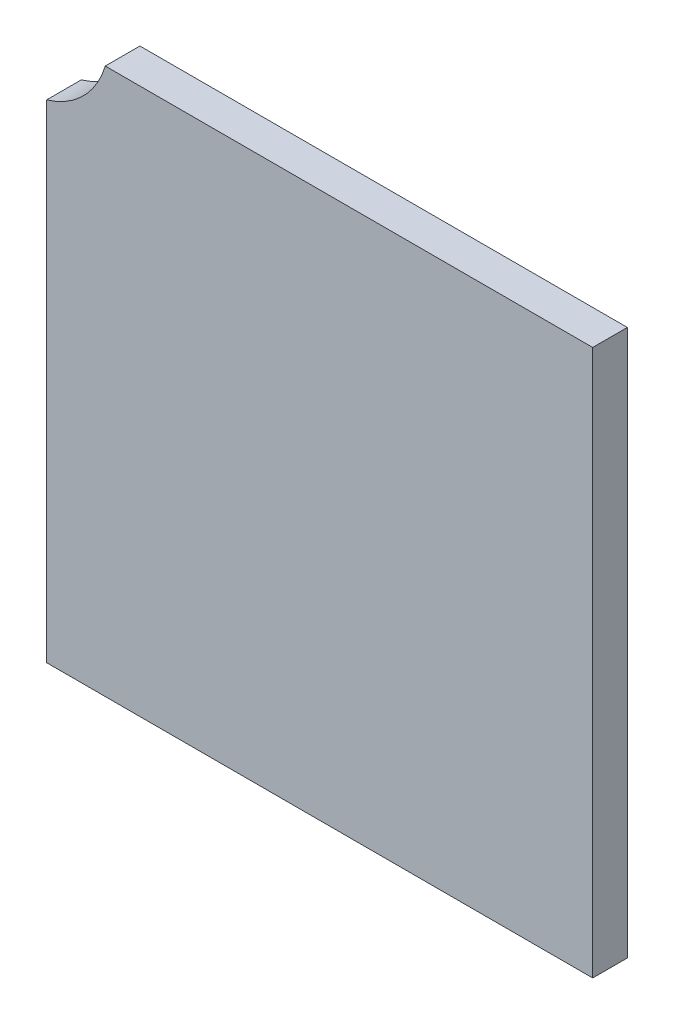
ISO-10303-21;
HEADER;
FILE_DESCRIPTION(('STEP AP214'),'2;1');
FILE_NAME('part.step','',(''),(''),'','','');
FILE_SCHEMA(('AUTOMOTIVE_DESIGN { 1 0 10303 214 1 1 1 1 }'));
ENDSEC;
DATA;
#1=APPLICATION_CONTEXT('core data for automotive mechanical design processes');
#2=APPLICATION_PROTOCOL_DEFINITION('international standard','automotive_design',2000,#1);
#3=PRODUCT_CONTEXT('',#1,'mechanical');
#4=PRODUCT('Part','Part','',(#3));
#5=PRODUCT_RELATED_PRODUCT_CATEGORY('part','',(#4));
#6=PRODUCT_DEFINITION_FORMATION('','',#4);
#7=PRODUCT_DEFINITION_CONTEXT('part definition',#1,'design');
#8=PRODUCT_DEFINITION('design','',#6,#7);
#9=PRODUCT_DEFINITION_SHAPE('','',#8);
#10=(LENGTH_UNIT() NAMED_UNIT(*) SI_UNIT(.MILLI.,.METRE.));
#11=(NAMED_UNIT(*) PLANE_ANGLE_UNIT() SI_UNIT($,.RADIAN.));
#12=(NAMED_UNIT(*) SI_UNIT($,.STERADIAN.) SOLID_ANGLE_UNIT());
#13=UNCERTAINTY_MEASURE_WITH_UNIT(LENGTH_MEASURE(1.E-05),#10,'distance_accuracy_value','');
#14=(GEOMETRIC_REPRESENTATION_CONTEXT(3) GLOBAL_UNCERTAINTY_ASSIGNED_CONTEXT((#13)) GLOBAL_UNIT_ASSIGNED_CONTEXT((#10,
#11,#12)) REPRESENTATION_CONTEXT('',''));
#15=CARTESIAN_POINT('',(0.,0.,0.));
#16=DIRECTION('',(0.,0.,1.));
#17=DIRECTION('',(1.,0.,0.));
#18=AXIS2_PLACEMENT_3D('',#15,#16,#17);
#19=CARTESIAN_POINT('',(-1.575,1.575,0.2));
#20=DIRECTION('',(-1.,0.,0.));
#21=DIRECTION('',(0.,-1.,0.));
#22=AXIS2_PLACEMENT_3D('',#19,#20,#21);
#23=PLANE('',#22);
#24=DIRECTION('',(0.,0.,1.));
#25=VECTOR('',#24,1.);
#26=CARTESIAN_POINT('',(-1.575,1.23683820390604,0.9));
#27=LINE('',#26,#25);
#28=CARTESIAN_POINT('',(-1.575,1.23683820390604,0.));
#29=VERTEX_POINT('',#28);
#30=CARTESIAN_POINT('',(-1.575,1.23683820390604,0.2));
#31=VERTEX_POINT('',#30);
#32=EDGE_CURVE('E11',#29,#31,#27,.T.);
#33=ORIENTED_EDGE('',*,*,#32,.F.);
#34=DIRECTION('',(0.,1.,0.));
#35=VECTOR('',#34,1.);
#36=CARTESIAN_POINT('',(-1.575,1.575,0.));
#37=LINE('',#36,#35);
#38=CARTESIAN_POINT('',(-1.575,-1.575,0.));
#39=VERTEX_POINT('',#38);
#40=EDGE_CURVE('E23',#39,#29,#37,.T.);
#41=ORIENTED_EDGE('',*,*,#40,.F.);
#42=DIRECTION('',(0.,0.,-1.));
#43=VECTOR('',#42,1.);
#44=CARTESIAN_POINT('',(-1.575,-1.575,0.2));
#45=LINE('',#44,#43);
#46=CARTESIAN_POINT('',(-1.575,-1.575,0.2));
#47=VERTEX_POINT('',#46);
#48=EDGE_CURVE('E98',#47,#39,#45,.T.);
#49=ORIENTED_EDGE('',*,*,#48,.F.);
#50=DIRECTION('',(0.,1.,0.));
#51=VECTOR('',#50,1.);
#52=CARTESIAN_POINT('',(-1.575,1.575,0.2));
#53=LINE('',#52,#51);
#54=EDGE_CURVE('E96',#47,#31,#53,.T.);
#55=ORIENTED_EDGE('',*,*,#54,.T.);
#56=EDGE_LOOP('',(#33,#41,#49,#55));
#57=FACE_BOUND('',#56,.T.);
#58=ADVANCED_FACE('F16',(#57),#23,.T.);
#59=CARTESIAN_POINT('',(1.575,-1.575,0.2));
#60=DIRECTION('',(0.,-1.,0.));
#61=DIRECTION('',(0.,0.,-1.));
#62=AXIS2_PLACEMENT_3D('',#59,#60,#61);
#63=PLANE('',#62);
#64=DIRECTION('',(-1.,0.,0.));
#65=VECTOR('',#64,1.);
#66=CARTESIAN_POINT('',(1.575,-1.575,0.));
#67=LINE('',#66,#65);
#68=CARTESIAN_POINT('',(1.575,-1.575,0.));
#69=VERTEX_POINT('',#68);
#70=EDGE_CURVE('E94',#69,#39,#67,.T.);
#71=ORIENTED_EDGE('',*,*,#70,.F.);
#72=DIRECTION('',(0.,0.,-1.));
#73=VECTOR('',#72,1.);
#74=CARTESIAN_POINT('',(1.575,-1.575,0.2));
#75=LINE('',#74,#73);
#76=CARTESIAN_POINT('',(1.575,-1.575,0.2));
#77=VERTEX_POINT('',#76);
#78=EDGE_CURVE('E91',#77,#69,#75,.T.);
#79=ORIENTED_EDGE('',*,*,#78,.F.);
#80=DIRECTION('',(-1.,0.,0.));
#81=VECTOR('',#80,1.);
#82=CARTESIAN_POINT('',(1.575,-1.575,0.2));
#83=LINE('',#82,#81);
#84=EDGE_CURVE('E88',#77,#47,#83,.T.);
#85=ORIENTED_EDGE('',*,*,#84,.T.);
#86=ORIENTED_EDGE('',*,*,#48,.T.);
#87=EDGE_LOOP('',(#71,#79,#85,#86));
#88=FACE_BOUND('',#87,.T.);
#89=ADVANCED_FACE('F101',(#88),#63,.T.);
#90=CARTESIAN_POINT('',(1.575,1.575,0.2));
#91=DIRECTION('',(1.,0.,0.));
#92=DIRECTION('',(0.,1.,0.));
#93=AXIS2_PLACEMENT_3D('',#90,#91,#92);
#94=PLANE('',#93);
#95=DIRECTION('',(0.,-1.,0.));
#96=VECTOR('',#95,1.);
#97=CARTESIAN_POINT('',(1.575,1.575,0.));
#98=LINE('',#97,#96);
#99=CARTESIAN_POINT('',(1.575,1.575,0.));
#100=VERTEX_POINT('',#99);
#101=EDGE_CURVE('E86',#100,#69,#98,.T.);
#102=ORIENTED_EDGE('',*,*,#101,.F.);
#103=DIRECTION('',(0.,0.,-1.));
#104=VECTOR('',#103,1.);
#105=CARTESIAN_POINT('',(1.575,1.575,0.2));
#106=LINE('',#105,#104);
#107=CARTESIAN_POINT('',(1.575,1.575,0.2));
#108=VERTEX_POINT('',#107);
#109=EDGE_CURVE('E73',#108,#100,#106,.T.);
#110=ORIENTED_EDGE('',*,*,#109,.F.);
#111=DIRECTION('',(0.,-1.,0.));
#112=VECTOR('',#111,1.);
#113=CARTESIAN_POINT('',(1.575,1.575,0.2));
#114=LINE('',#113,#112);
#115=EDGE_CURVE('E66',#108,#77,#114,.T.);
#116=ORIENTED_EDGE('',*,*,#115,.T.);
#117=ORIENTED_EDGE('',*,*,#78,.T.);
#118=EDGE_LOOP('',(#102,#110,#116,#117));
#119=FACE_BOUND('',#118,.T.);
#120=ADVANCED_FACE('F105',(#119),#94,.T.);
#121=CARTESIAN_POINT('',(1.575,1.575,0.2));
#122=DIRECTION('',(0.,1.,0.));
#123=DIRECTION('',(0.,0.,1.));
#124=AXIS2_PLACEMENT_3D('',#121,#122,#123);
#125=PLANE('',#124);
#126=DIRECTION('',(0.,0.,-1.));
#127=VECTOR('',#126,1.);
#128=CARTESIAN_POINT('',(-1.23683820390604,1.575,0.9));
#129=LINE('',#128,#127);
#130=CARTESIAN_POINT('',(-1.23683820390604,1.575,0.2));
#131=VERTEX_POINT('',#130);
#132=CARTESIAN_POINT('',(-1.23683820390604,1.575,0.));
#133=VERTEX_POINT('',#132);
#134=EDGE_CURVE('E56',#131,#133,#129,.T.);
#135=ORIENTED_EDGE('',*,*,#134,.F.);
#136=DIRECTION('',(1.,0.,0.));
#137=VECTOR('',#136,1.);
#138=CARTESIAN_POINT('',(1.575,1.575,0.2));
#139=LINE('',#138,#137);
#140=EDGE_CURVE('E67',#131,#108,#139,.T.);
#141=ORIENTED_EDGE('',*,*,#140,.T.);
#142=ORIENTED_EDGE('',*,*,#109,.T.);
#143=DIRECTION('',(1.,0.,0.));
#144=VECTOR('',#143,1.);
#145=CARTESIAN_POINT('',(1.575,1.575,0.));
#146=LINE('',#145,#144);
#147=EDGE_CURVE('E71',#133,#100,#146,.T.);
#148=ORIENTED_EDGE('',*,*,#147,.F.);
#149=EDGE_LOOP('',(#135,#141,#142,#148));
#150=FACE_BOUND('',#149,.T.);
#151=ADVANCED_FACE('F72',(#150),#125,.T.);
#152=CARTESIAN_POINT('',(0.,0.,0.2));
#153=DIRECTION('',(0.,0.,-1.));
#154=DIRECTION('',(-1.,0.,0.));
#155=AXIS2_PLACEMENT_3D('',#152,#153,#154);
#156=PLANE('',#155);
#157=ORIENTED_EDGE('',*,*,#140,.F.);
#158=CARTESIAN_POINT('',(-1.71642135623731,1.71642135623731,0.2));
#159=DIRECTION('',(0.,0.,-1.));
#160=DIRECTION('',(-1.,0.,0.));
#161=AXIS2_PLACEMENT_3D('',#158,#159,#160);
#162=CIRCLE('',#161,0.5);
#163=EDGE_CURVE('E62',#131,#31,#162,.T.);
#164=ORIENTED_EDGE('',*,*,#163,.T.);
#165=ORIENTED_EDGE('',*,*,#54,.F.);
#166=ORIENTED_EDGE('',*,*,#84,.F.);
#167=ORIENTED_EDGE('',*,*,#115,.F.);
#168=EDGE_LOOP('',(#157,#164,#165,#166,#167));
#169=FACE_BOUND('',#168,.T.);
#170=ADVANCED_FACE('F108',(#169),#156,.F.);
#171=CARTESIAN_POINT('',(0.,0.,0.));
#172=DIRECTION('',(0.,0.,-1.));
#173=DIRECTION('',(-1.,0.,0.));
#174=AXIS2_PLACEMENT_3D('',#171,#172,#173);
#175=PLANE('',#174);
#176=CARTESIAN_POINT('',(-1.71642135623731,1.71642135623731,0.));
#177=DIRECTION('',(0.,0.,-1.));
#178=DIRECTION('',(-1.,0.,0.));
#179=AXIS2_PLACEMENT_3D('',#176,#177,#178);
#180=CIRCLE('',#179,0.5);
#181=EDGE_CURVE('E60',#133,#29,#180,.T.);
#182=ORIENTED_EDGE('',*,*,#181,.F.);
#183=ORIENTED_EDGE('',*,*,#147,.T.);
#184=ORIENTED_EDGE('',*,*,#101,.T.);
#185=ORIENTED_EDGE('',*,*,#70,.T.);
#186=ORIENTED_EDGE('',*,*,#40,.T.);
#187=EDGE_LOOP('',(#182,#183,#184,#185,#186));
#188=FACE_BOUND('',#187,.T.);
#189=ADVANCED_FACE('F77',(#188),#175,.T.);
#190=CARTESIAN_POINT('',(-1.71642135623731,1.71642135623731,0.9));
#191=DIRECTION('',(0.,0.,-1.));
#192=DIRECTION('',(-1.,0.,0.));
#193=AXIS2_PLACEMENT_3D('',#190,#191,#192);
#194=CYLINDRICAL_SURFACE('',#193,0.5);
#195=ORIENTED_EDGE('',*,*,#32,.T.);
#196=ORIENTED_EDGE('',*,*,#163,.F.);
#197=ORIENTED_EDGE('',*,*,#134,.T.);
#198=ORIENTED_EDGE('',*,*,#181,.T.);
#199=EDGE_LOOP('',(#195,#196,#197,#198));
#200=FACE_BOUND('',#199,.T.);
#201=ADVANCED_FACE('F58',(#200),#194,.F.);
#202=CLOSED_SHELL('',(#58,#89,#120,#151,#170,#189,#201));
#203=MANIFOLD_SOLID_BREP('B1',#202);
#204=ADVANCED_BREP_SHAPE_REPRESENTATION('',(#18,#203),#14);
#205=SHAPE_DEFINITION_REPRESENTATION(#9,#204);
ENDSEC;
END-ISO-10303-21;
